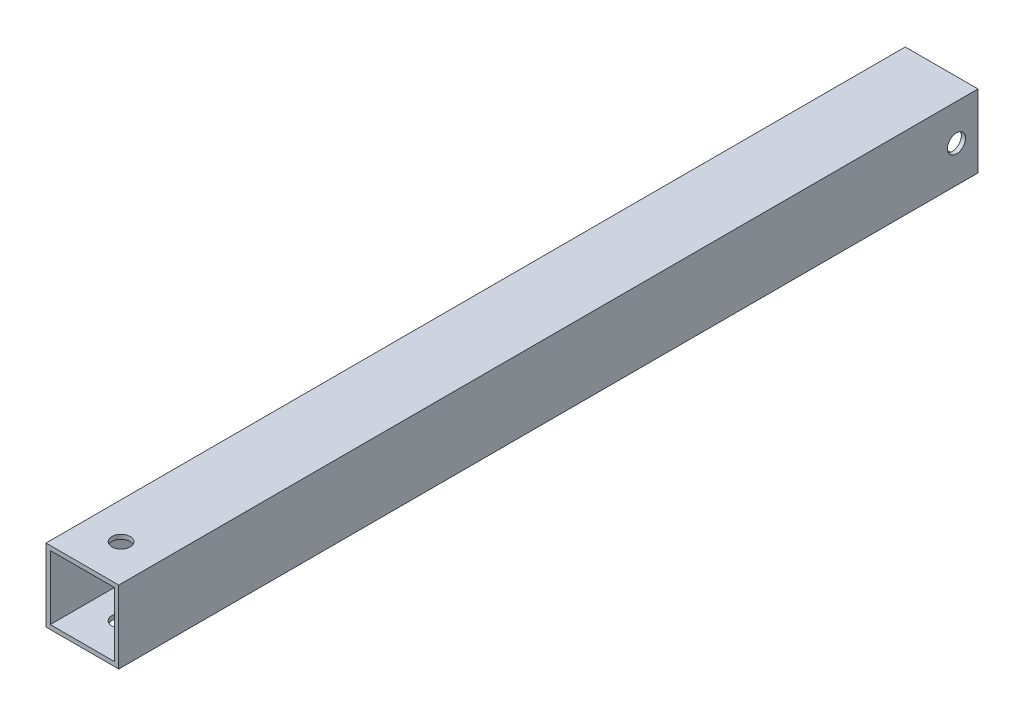
ISO-10303-21;
HEADER;
FILE_DESCRIPTION(('STEP AP214'),'2;1');
FILE_NAME('part.step','',(''),(''),'','','');
FILE_SCHEMA(('AUTOMOTIVE_DESIGN { 1 0 10303 214 1 1 1 1 }'));
ENDSEC;
DATA;
#1=APPLICATION_CONTEXT('core data for automotive mechanical design processes');
#2=APPLICATION_PROTOCOL_DEFINITION('international standard','automotive_design',2000,#1);
#3=PRODUCT_CONTEXT('',#1,'mechanical');
#4=PRODUCT('Part','Part','',(#3));
#5=PRODUCT_RELATED_PRODUCT_CATEGORY('part','',(#4));
#6=PRODUCT_DEFINITION_FORMATION('','',#4);
#7=PRODUCT_DEFINITION_CONTEXT('part definition',#1,'design');
#8=PRODUCT_DEFINITION('design','',#6,#7);
#9=PRODUCT_DEFINITION_SHAPE('','',#8);
#10=(LENGTH_UNIT() NAMED_UNIT(*) SI_UNIT(.MILLI.,.METRE.));
#11=(NAMED_UNIT(*) PLANE_ANGLE_UNIT() SI_UNIT($,.RADIAN.));
#12=(NAMED_UNIT(*) SI_UNIT($,.STERADIAN.) SOLID_ANGLE_UNIT());
#13=UNCERTAINTY_MEASURE_WITH_UNIT(LENGTH_MEASURE(1.E-05),#10,'distance_accuracy_value','');
#14=(GEOMETRIC_REPRESENTATION_CONTEXT(3) GLOBAL_UNCERTAINTY_ASSIGNED_CONTEXT((#13)) GLOBAL_UNIT_ASSIGNED_CONTEXT((#10,
#11,#12)) REPRESENTATION_CONTEXT('',''));
#15=CARTESIAN_POINT('',(0.,0.,0.));
#16=DIRECTION('',(0.,0.,1.));
#17=DIRECTION('',(1.,0.,0.));
#18=AXIS2_PLACEMENT_3D('',#15,#16,#17);
#19=CARTESIAN_POINT('',(0.,0.,300.));
#20=DIRECTION('',(0.,0.,-1.));
#21=DIRECTION('',(-1.,0.,0.));
#22=AXIS2_PLACEMENT_3D('',#19,#20,#21);
#23=PLANE('',#22);
#24=DIRECTION('',(0.,1.,0.));
#25=VECTOR('',#24,1.);
#26=CARTESIAN_POINT('',(25.4,-25.4,300.));
#27=LINE('',#26,#25);
#28=CARTESIAN_POINT('',(25.4,-25.4,300.));
#29=VERTEX_POINT('',#28);
#30=CARTESIAN_POINT('',(25.4,25.4,300.));
#31=VERTEX_POINT('',#30);
#32=EDGE_CURVE('E142',#29,#31,#27,.T.);
#33=ORIENTED_EDGE('',*,*,#32,.T.);
#34=DIRECTION('',(-1.,0.,0.));
#35=VECTOR('',#34,1.);
#36=CARTESIAN_POINT('',(-25.4,25.4,300.));
#37=LINE('',#36,#35);
#38=CARTESIAN_POINT('',(-25.4,25.4,300.));
#39=VERTEX_POINT('',#38);
#40=EDGE_CURVE('E145',#31,#39,#37,.T.);
#41=ORIENTED_EDGE('',*,*,#40,.T.);
#42=DIRECTION('',(0.,-1.,0.));
#43=VECTOR('',#42,1.);
#44=CARTESIAN_POINT('',(-25.4,-25.4,300.));
#45=LINE('',#44,#43);
#46=CARTESIAN_POINT('',(-25.4,-25.4,300.));
#47=VERTEX_POINT('',#46);
#48=EDGE_CURVE('E148',#39,#47,#45,.T.);
#49=ORIENTED_EDGE('',*,*,#48,.T.);
#50=DIRECTION('',(1.,0.,0.));
#51=VECTOR('',#50,1.);
#52=CARTESIAN_POINT('',(-25.4,-25.4,300.));
#53=LINE('',#52,#51);
#54=EDGE_CURVE('E150',#47,#29,#53,.T.);
#55=ORIENTED_EDGE('',*,*,#54,.T.);
#56=EDGE_LOOP('',(#33,#41,#49,#55));
#57=FACE_BOUND('',#56,.T.);
#58=DIRECTION('',(0.,-1.,0.));
#59=VECTOR('',#58,1.);
#60=CARTESIAN_POINT('',(-22.4,-22.4,300.));
#61=LINE('',#60,#59);
#62=CARTESIAN_POINT('',(-22.4,22.4,300.));
#63=VERTEX_POINT('',#62);
#64=CARTESIAN_POINT('',(-22.4,-22.4,300.));
#65=VERTEX_POINT('',#64);
#66=EDGE_CURVE('E104',#63,#65,#61,.T.);
#67=ORIENTED_EDGE('',*,*,#66,.F.);
#68=DIRECTION('',(-1.,0.,0.));
#69=VECTOR('',#68,1.);
#70=CARTESIAN_POINT('',(-22.4,22.4,300.));
#71=LINE('',#70,#69);
#72=CARTESIAN_POINT('',(22.4,22.4,300.));
#73=VERTEX_POINT('',#72);
#74=EDGE_CURVE('E126',#73,#63,#71,.T.);
#75=ORIENTED_EDGE('',*,*,#74,.F.);
#76=DIRECTION('',(0.,1.,0.));
#77=VECTOR('',#76,1.);
#78=CARTESIAN_POINT('',(22.4,-22.4,300.));
#79=LINE('',#78,#77);
#80=CARTESIAN_POINT('',(22.4,-22.4,300.));
#81=VERTEX_POINT('',#80);
#82=EDGE_CURVE('E124',#81,#73,#79,.T.);
#83=ORIENTED_EDGE('',*,*,#82,.F.);
#84=DIRECTION('',(1.,0.,0.));
#85=VECTOR('',#84,1.);
#86=CARTESIAN_POINT('',(-22.4,-22.4,300.));
#87=LINE('',#86,#85);
#88=EDGE_CURVE('E112',#65,#81,#87,.T.);
#89=ORIENTED_EDGE('',*,*,#88,.F.);
#90=EDGE_LOOP('',(#67,#75,#83,#89));
#91=FACE_BOUND('',#90,.T.);
#92=ADVANCED_FACE('F37',(#57,#91),#23,.F.);
#93=CARTESIAN_POINT('',(0.,0.,-300.));
#94=DIRECTION('',(0.,0.,-1.));
#95=DIRECTION('',(-1.,0.,0.));
#96=AXIS2_PLACEMENT_3D('',#93,#94,#95);
#97=PLANE('',#96);
#98=DIRECTION('',(0.,1.,0.));
#99=VECTOR('',#98,1.);
#100=CARTESIAN_POINT('',(25.4,-25.4,-300.));
#101=LINE('',#100,#99);
#102=CARTESIAN_POINT('',(25.4,-25.4,-300.));
#103=VERTEX_POINT('',#102);
#104=CARTESIAN_POINT('',(25.4,25.4,-300.));
#105=VERTEX_POINT('',#104);
#106=EDGE_CURVE('E120',#103,#105,#101,.T.);
#107=ORIENTED_EDGE('',*,*,#106,.F.);
#108=DIRECTION('',(1.,0.,0.));
#109=VECTOR('',#108,1.);
#110=CARTESIAN_POINT('',(-25.4,-25.4,-300.));
#111=LINE('',#110,#109);
#112=CARTESIAN_POINT('',(-25.4,-25.4,-300.));
#113=VERTEX_POINT('',#112);
#114=EDGE_CURVE('E146',#113,#103,#111,.T.);
#115=ORIENTED_EDGE('',*,*,#114,.F.);
#116=DIRECTION('',(0.,-1.,0.));
#117=VECTOR('',#116,1.);
#118=CARTESIAN_POINT('',(-25.4,-25.4,-300.));
#119=LINE('',#118,#117);
#120=CARTESIAN_POINT('',(-25.4,25.4,-300.));
#121=VERTEX_POINT('',#120);
#122=EDGE_CURVE('E157',#121,#113,#119,.T.);
#123=ORIENTED_EDGE('',*,*,#122,.F.);
#124=DIRECTION('',(-1.,0.,0.));
#125=VECTOR('',#124,1.);
#126=CARTESIAN_POINT('',(-25.4,25.4,-300.));
#127=LINE('',#126,#125);
#128=EDGE_CURVE('E155',#105,#121,#127,.T.);
#129=ORIENTED_EDGE('',*,*,#128,.F.);
#130=EDGE_LOOP('',(#107,#115,#123,#129));
#131=FACE_BOUND('',#130,.T.);
#132=DIRECTION('',(-1.,0.,0.));
#133=VECTOR('',#132,1.);
#134=CARTESIAN_POINT('',(-22.4,22.4,-300.));
#135=LINE('',#134,#133);
#136=CARTESIAN_POINT('',(22.4,22.4,-300.));
#137=VERTEX_POINT('',#136);
#138=CARTESIAN_POINT('',(-22.4,22.4,-300.));
#139=VERTEX_POINT('',#138);
#140=EDGE_CURVE('E113',#137,#139,#135,.T.);
#141=ORIENTED_EDGE('',*,*,#140,.T.);
#142=DIRECTION('',(0.,-1.,0.));
#143=VECTOR('',#142,1.);
#144=CARTESIAN_POINT('',(-22.4,-22.4,-300.));
#145=LINE('',#144,#143);
#146=CARTESIAN_POINT('',(-22.4,-22.4,-300.));
#147=VERTEX_POINT('',#146);
#148=EDGE_CURVE('E62',#139,#147,#145,.T.);
#149=ORIENTED_EDGE('',*,*,#148,.T.);
#150=DIRECTION('',(1.,0.,0.));
#151=VECTOR('',#150,1.);
#152=CARTESIAN_POINT('',(-22.4,-22.4,-300.));
#153=LINE('',#152,#151);
#154=CARTESIAN_POINT('',(22.4,-22.4,-300.));
#155=VERTEX_POINT('',#154);
#156=EDGE_CURVE('E119',#147,#155,#153,.T.);
#157=ORIENTED_EDGE('',*,*,#156,.T.);
#158=DIRECTION('',(0.,1.,0.));
#159=VECTOR('',#158,1.);
#160=CARTESIAN_POINT('',(22.4,-22.4,-300.));
#161=LINE('',#160,#159);
#162=EDGE_CURVE('E134',#155,#137,#161,.T.);
#163=ORIENTED_EDGE('',*,*,#162,.T.);
#164=EDGE_LOOP('',(#141,#149,#157,#163));
#165=FACE_BOUND('',#164,.T.);
#166=ADVANCED_FACE('F202',(#131,#165),#97,.T.);
#167=CARTESIAN_POINT('',(25.4,-25.4,300.));
#168=DIRECTION('',(-1.,0.,0.));
#169=DIRECTION('',(0.,0.,1.));
#170=AXIS2_PLACEMENT_3D('',#167,#168,#169);
#171=PLANE('',#170);
#172=CARTESIAN_POINT('',(25.4,0.,-285.));
#173=DIRECTION('',(1.,0.,0.));
#174=DIRECTION('',(0.,0.,1.));
#175=AXIS2_PLACEMENT_3D('',#172,#173,#174);
#176=CIRCLE('',#175,6.35);
#177=CARTESIAN_POINT('',(25.4,0.,-278.65));
#178=VERTEX_POINT('',#177);
#179=EDGE_CURVE('E173',#178,#178,#176,.T.);
#180=ORIENTED_EDGE('',*,*,#179,.F.);
#181=EDGE_LOOP('',(#180));
#182=FACE_BOUND('',#181,.T.);
#183=ORIENTED_EDGE('',*,*,#106,.T.);
#184=DIRECTION('',(0.,0.,-1.));
#185=VECTOR('',#184,1.);
#186=CARTESIAN_POINT('',(25.4,25.4,300.));
#187=LINE('',#186,#185);
#188=EDGE_CURVE('E11',#31,#105,#187,.T.);
#189=ORIENTED_EDGE('',*,*,#188,.F.);
#190=ORIENTED_EDGE('',*,*,#32,.F.);
#191=DIRECTION('',(0.,0.,-1.));
#192=VECTOR('',#191,1.);
#193=CARTESIAN_POINT('',(25.4,-25.4,300.));
#194=LINE('',#193,#192);
#195=EDGE_CURVE('E152',#29,#103,#194,.T.);
#196=ORIENTED_EDGE('',*,*,#195,.T.);
#197=EDGE_LOOP('',(#183,#189,#190,#196));
#198=FACE_BOUND('',#197,.T.);
#199=ADVANCED_FACE('F39',(#182,#198),#171,.F.);
#200=CARTESIAN_POINT('',(-25.4,25.4,300.));
#201=DIRECTION('',(0.,-1.,0.));
#202=DIRECTION('',(0.,0.,-1.));
#203=AXIS2_PLACEMENT_3D('',#200,#201,#202);
#204=PLANE('',#203);
#205=CARTESIAN_POINT('',(0.,25.4,273.));
#206=DIRECTION('',(0.,1.,0.));
#207=DIRECTION('',(0.,0.,1.));
#208=AXIS2_PLACEMENT_3D('',#205,#206,#207);
#209=CIRCLE('',#208,6.35);
#210=CARTESIAN_POINT('',(0.,25.4,279.35));
#211=VERTEX_POINT('',#210);
#212=EDGE_CURVE('E186',#211,#211,#209,.T.);
#213=ORIENTED_EDGE('',*,*,#212,.F.);
#214=EDGE_LOOP('',(#213));
#215=FACE_BOUND('',#214,.T.);
#216=ORIENTED_EDGE('',*,*,#128,.T.);
#217=DIRECTION('',(0.,0.,-1.));
#218=VECTOR('',#217,1.);
#219=CARTESIAN_POINT('',(-25.4,25.4,300.));
#220=LINE('',#219,#218);
#221=EDGE_CURVE('E46',#39,#121,#220,.T.);
#222=ORIENTED_EDGE('',*,*,#221,.F.);
#223=ORIENTED_EDGE('',*,*,#40,.F.);
#224=ORIENTED_EDGE('',*,*,#188,.T.);
#225=EDGE_LOOP('',(#216,#222,#223,#224));
#226=FACE_BOUND('',#225,.T.);
#227=ADVANCED_FACE('F228',(#215,#226),#204,.F.);
#228=CARTESIAN_POINT('',(-25.4,-25.4,300.));
#229=DIRECTION('',(1.,0.,0.));
#230=DIRECTION('',(0.,0.,-1.));
#231=AXIS2_PLACEMENT_3D('',#228,#229,#230);
#232=PLANE('',#231);
#233=CARTESIAN_POINT('',(-25.4,0.,-285.));
#234=DIRECTION('',(1.,0.,0.));
#235=DIRECTION('',(0.,0.,1.));
#236=AXIS2_PLACEMENT_3D('',#233,#234,#235);
#237=CIRCLE('',#236,6.35);
#238=CARTESIAN_POINT('',(-25.4,0.,-278.65));
#239=VERTEX_POINT('',#238);
#240=EDGE_CURVE('E168',#239,#239,#237,.T.);
#241=ORIENTED_EDGE('',*,*,#240,.T.);
#242=EDGE_LOOP('',(#241));
#243=FACE_BOUND('',#242,.T.);
#244=ORIENTED_EDGE('',*,*,#122,.T.);
#245=DIRECTION('',(0.,0.,-1.));
#246=VECTOR('',#245,1.);
#247=CARTESIAN_POINT('',(-25.4,-25.4,300.));
#248=LINE('',#247,#246);
#249=EDGE_CURVE('E162',#47,#113,#248,.T.);
#250=ORIENTED_EDGE('',*,*,#249,.F.);
#251=ORIENTED_EDGE('',*,*,#48,.F.);
#252=ORIENTED_EDGE('',*,*,#221,.T.);
#253=EDGE_LOOP('',(#244,#250,#251,#252));
#254=FACE_BOUND('',#253,.T.);
#255=ADVANCED_FACE('F225',(#243,#254),#232,.F.);
#256=CARTESIAN_POINT('',(-25.4,-25.4,300.));
#257=DIRECTION('',(0.,1.,0.));
#258=DIRECTION('',(0.,0.,1.));
#259=AXIS2_PLACEMENT_3D('',#256,#257,#258);
#260=PLANE('',#259);
#261=CARTESIAN_POINT('',(0.,-25.4,273.));
#262=DIRECTION('',(0.,1.,0.));
#263=DIRECTION('',(0.,0.,1.));
#264=AXIS2_PLACEMENT_3D('',#261,#262,#263);
#265=CIRCLE('',#264,6.35);
#266=CARTESIAN_POINT('',(0.,-25.4,279.35));
#267=VERTEX_POINT('',#266);
#268=EDGE_CURVE('E178',#267,#267,#265,.T.);
#269=ORIENTED_EDGE('',*,*,#268,.T.);
#270=EDGE_LOOP('',(#269));
#271=FACE_BOUND('',#270,.T.);
#272=ORIENTED_EDGE('',*,*,#114,.T.);
#273=ORIENTED_EDGE('',*,*,#195,.F.);
#274=ORIENTED_EDGE('',*,*,#54,.F.);
#275=ORIENTED_EDGE('',*,*,#249,.T.);
#276=EDGE_LOOP('',(#272,#273,#274,#275));
#277=FACE_BOUND('',#276,.T.);
#278=ADVANCED_FACE('F222',(#271,#277),#260,.F.);
#279=CARTESIAN_POINT('',(-22.4,-22.4,300.));
#280=DIRECTION('',(1.,0.,0.));
#281=DIRECTION('',(0.,0.,-1.));
#282=AXIS2_PLACEMENT_3D('',#279,#280,#281);
#283=PLANE('',#282);
#284=CARTESIAN_POINT('',(-22.4,0.,-285.));
#285=DIRECTION('',(1.,0.,0.));
#286=DIRECTION('',(0.,0.,-1.));
#287=AXIS2_PLACEMENT_3D('',#284,#285,#286);
#288=CIRCLE('',#287,6.35);
#289=CARTESIAN_POINT('',(-22.4,0.,-291.35));
#290=VERTEX_POINT('',#289);
#291=EDGE_CURVE('E132',#290,#290,#288,.T.);
#292=ORIENTED_EDGE('',*,*,#291,.F.);
#293=EDGE_LOOP('',(#292));
#294=FACE_BOUND('',#293,.T.);
#295=ORIENTED_EDGE('',*,*,#148,.F.);
#296=DIRECTION('',(0.,0.,-1.));
#297=VECTOR('',#296,1.);
#298=CARTESIAN_POINT('',(-22.4,22.4,300.));
#299=LINE('',#298,#297);
#300=EDGE_CURVE('E108',#63,#139,#299,.T.);
#301=ORIENTED_EDGE('',*,*,#300,.F.);
#302=ORIENTED_EDGE('',*,*,#66,.T.);
#303=DIRECTION('',(0.,0.,-1.));
#304=VECTOR('',#303,1.);
#305=CARTESIAN_POINT('',(-22.4,-22.4,300.));
#306=LINE('',#305,#304);
#307=EDGE_CURVE('E107',#65,#147,#306,.T.);
#308=ORIENTED_EDGE('',*,*,#307,.T.);
#309=EDGE_LOOP('',(#295,#301,#302,#308));
#310=FACE_BOUND('',#309,.T.);
#311=ADVANCED_FACE('F106',(#294,#310),#283,.T.);
#312=CARTESIAN_POINT('',(-22.4,-22.4,300.));
#313=DIRECTION('',(0.,1.,0.));
#314=DIRECTION('',(0.,0.,1.));
#315=AXIS2_PLACEMENT_3D('',#312,#313,#314);
#316=PLANE('',#315);
#317=CARTESIAN_POINT('',(0.,-22.4,273.));
#318=DIRECTION('',(0.,1.,0.));
#319=DIRECTION('',(0.,0.,1.));
#320=AXIS2_PLACEMENT_3D('',#317,#318,#319);
#321=CIRCLE('',#320,6.35);
#322=CARTESIAN_POINT('',(0.,-22.4,279.35));
#323=VERTEX_POINT('',#322);
#324=EDGE_CURVE('E183',#323,#323,#321,.T.);
#325=ORIENTED_EDGE('',*,*,#324,.F.);
#326=EDGE_LOOP('',(#325));
#327=FACE_BOUND('',#326,.T.);
#328=ORIENTED_EDGE('',*,*,#156,.F.);
#329=ORIENTED_EDGE('',*,*,#307,.F.);
#330=ORIENTED_EDGE('',*,*,#88,.T.);
#331=DIRECTION('',(0.,0.,-1.));
#332=VECTOR('',#331,1.);
#333=CARTESIAN_POINT('',(22.4,-22.4,300.));
#334=LINE('',#333,#332);
#335=EDGE_CURVE('E121',#81,#155,#334,.T.);
#336=ORIENTED_EDGE('',*,*,#335,.T.);
#337=EDGE_LOOP('',(#328,#329,#330,#336));
#338=FACE_BOUND('',#337,.T.);
#339=ADVANCED_FACE('F116',(#327,#338),#316,.T.);
#340=CARTESIAN_POINT('',(22.4,-22.4,300.));
#341=DIRECTION('',(-1.,0.,0.));
#342=DIRECTION('',(0.,-1.,0.));
#343=AXIS2_PLACEMENT_3D('',#340,#341,#342);
#344=PLANE('',#343);
#345=CARTESIAN_POINT('',(22.4,0.,-285.));
#346=DIRECTION('',(-1.,0.,0.));
#347=DIRECTION('',(0.,-1.,0.));
#348=AXIS2_PLACEMENT_3D('',#345,#346,#347);
#349=CIRCLE('',#348,6.35);
#350=CARTESIAN_POINT('',(22.4,-6.35,-285.));
#351=VERTEX_POINT('',#350);
#352=EDGE_CURVE('E166',#351,#351,#349,.T.);
#353=ORIENTED_EDGE('',*,*,#352,.F.);
#354=EDGE_LOOP('',(#353));
#355=FACE_BOUND('',#354,.T.);
#356=ORIENTED_EDGE('',*,*,#162,.F.);
#357=ORIENTED_EDGE('',*,*,#335,.F.);
#358=ORIENTED_EDGE('',*,*,#82,.T.);
#359=DIRECTION('',(0.,0.,-1.));
#360=VECTOR('',#359,1.);
#361=CARTESIAN_POINT('',(22.4,22.4,300.));
#362=LINE('',#361,#360);
#363=EDGE_CURVE('E54',#73,#137,#362,.T.);
#364=ORIENTED_EDGE('',*,*,#363,.T.);
#365=EDGE_LOOP('',(#356,#357,#358,#364));
#366=FACE_BOUND('',#365,.T.);
#367=ADVANCED_FACE('F198',(#355,#366),#344,.T.);
#368=CARTESIAN_POINT('',(-22.4,22.4,300.));
#369=DIRECTION('',(0.,-1.,0.));
#370=DIRECTION('',(1.,0.,0.));
#371=AXIS2_PLACEMENT_3D('',#368,#369,#370);
#372=PLANE('',#371);
#373=CARTESIAN_POINT('',(0.,22.4,273.));
#374=DIRECTION('',(0.,-1.,0.));
#375=DIRECTION('',(1.,0.,0.));
#376=AXIS2_PLACEMENT_3D('',#373,#374,#375);
#377=CIRCLE('',#376,6.35);
#378=CARTESIAN_POINT('',(6.35,22.4,273.));
#379=VERTEX_POINT('',#378);
#380=EDGE_CURVE('E41',#379,#379,#377,.T.);
#381=ORIENTED_EDGE('',*,*,#380,.F.);
#382=EDGE_LOOP('',(#381));
#383=FACE_BOUND('',#382,.T.);
#384=ORIENTED_EDGE('',*,*,#140,.F.);
#385=ORIENTED_EDGE('',*,*,#363,.F.);
#386=ORIENTED_EDGE('',*,*,#74,.T.);
#387=ORIENTED_EDGE('',*,*,#300,.T.);
#388=EDGE_LOOP('',(#384,#385,#386,#387));
#389=FACE_BOUND('',#388,.T.);
#390=ADVANCED_FACE('F195',(#383,#389),#372,.T.);
#391=CARTESIAN_POINT('',(-25.4,0.,-285.));
#392=DIRECTION('',(1.,0.,0.));
#393=DIRECTION('',(0.,0.,-1.));
#394=AXIS2_PLACEMENT_3D('',#391,#392,#393);
#395=CYLINDRICAL_SURFACE('',#394,6.35);
#396=ORIENTED_EDGE('',*,*,#352,.T.);
#397=EDGE_LOOP('',(#396));
#398=FACE_BOUND('',#397,.T.);
#399=ORIENTED_EDGE('',*,*,#179,.T.);
#400=EDGE_LOOP('',(#399));
#401=FACE_BOUND('',#400,.T.);
#402=ADVANCED_FACE('F197',(#398,#401),#395,.F.);
#403=ORIENTED_EDGE('',*,*,#291,.T.);
#404=EDGE_LOOP('',(#403));
#405=FACE_BOUND('',#404,.T.);
#406=ORIENTED_EDGE('',*,*,#240,.F.);
#407=EDGE_LOOP('',(#406));
#408=FACE_BOUND('',#407,.T.);
#409=ADVANCED_FACE('F254',(#405,#408),#395,.F.);
#410=CARTESIAN_POINT('',(0.,-44.6,273.));
#411=DIRECTION('',(0.,1.,0.));
#412=DIRECTION('',(0.,0.,1.));
#413=AXIS2_PLACEMENT_3D('',#410,#411,#412);
#414=CYLINDRICAL_SURFACE('',#413,6.35);
#415=ORIENTED_EDGE('',*,*,#380,.T.);
#416=EDGE_LOOP('',(#415));
#417=FACE_BOUND('',#416,.T.);
#418=ORIENTED_EDGE('',*,*,#212,.T.);
#419=EDGE_LOOP('',(#418));
#420=FACE_BOUND('',#419,.T.);
#421=ADVANCED_FACE('F193',(#417,#420),#414,.F.);
#422=ORIENTED_EDGE('',*,*,#324,.T.);
#423=EDGE_LOOP('',(#422));
#424=FACE_BOUND('',#423,.T.);
#425=ORIENTED_EDGE('',*,*,#268,.F.);
#426=EDGE_LOOP('',(#425));
#427=FACE_BOUND('',#426,.T.);
#428=ADVANCED_FACE('F262',(#424,#427),#414,.F.);
#429=CLOSED_SHELL('',(#92,#166,#199,#227,#255,#278,#311,#339,#367,#390,#402,#409,#421,#428));
#430=MANIFOLD_SOLID_BREP('B2',#429);
#431=ADVANCED_BREP_SHAPE_REPRESENTATION('',(#18,#430),#14);
#432=SHAPE_DEFINITION_REPRESENTATION(#9,#431);
ENDSEC;
END-ISO-10303-21;
